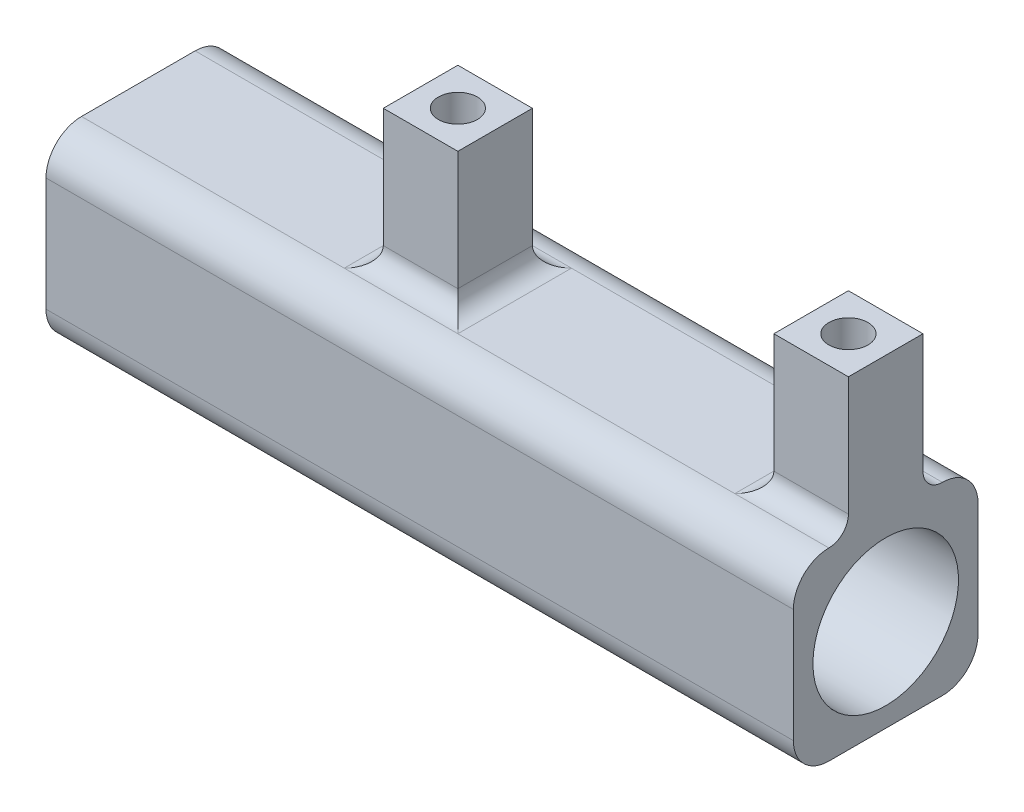
ISO-10303-21;
HEADER;
FILE_DESCRIPTION(('STEP AP214'),'2;1');
FILE_NAME('part.step','',(''),(''),'','','');
FILE_SCHEMA(('AUTOMOTIVE_DESIGN { 1 0 10303 214 1 1 1 1 }'));
ENDSEC;
DATA;
#1=APPLICATION_CONTEXT('core data for automotive mechanical design processes');
#2=APPLICATION_PROTOCOL_DEFINITION('international standard','automotive_design',2000,#1);
#3=PRODUCT_CONTEXT('',#1,'mechanical');
#4=PRODUCT('Part','Part','',(#3));
#5=PRODUCT_RELATED_PRODUCT_CATEGORY('part','',(#4));
#6=PRODUCT_DEFINITION_FORMATION('','',#4);
#7=PRODUCT_DEFINITION_CONTEXT('part definition',#1,'design');
#8=PRODUCT_DEFINITION('design','',#6,#7);
#9=PRODUCT_DEFINITION_SHAPE('','',#8);
#10=(LENGTH_UNIT() NAMED_UNIT(*) SI_UNIT(.MILLI.,.METRE.));
#11=(NAMED_UNIT(*) PLANE_ANGLE_UNIT() SI_UNIT($,.RADIAN.));
#12=(NAMED_UNIT(*) SI_UNIT($,.STERADIAN.) SOLID_ANGLE_UNIT());
#13=UNCERTAINTY_MEASURE_WITH_UNIT(LENGTH_MEASURE(1.E-05),#10,'distance_accuracy_value','');
#14=(GEOMETRIC_REPRESENTATION_CONTEXT(3) GLOBAL_UNCERTAINTY_ASSIGNED_CONTEXT((#13)) GLOBAL_UNIT_ASSIGNED_CONTEXT((#10,
#11,#12)) REPRESENTATION_CONTEXT('',''));
#15=CARTESIAN_POINT('',(0.,0.,0.));
#16=DIRECTION('',(0.,0.,1.));
#17=DIRECTION('',(1.,0.,0.));
#18=AXIS2_PLACEMENT_3D('',#15,#16,#17);
#19=CARTESIAN_POINT('',(0.,13.,13.));
#20=DIRECTION('',(0.,1.,0.));
#21=DIRECTION('',(-1.,0.,0.));
#22=AXIS2_PLACEMENT_3D('',#19,#20,#21);
#23=PLANE('',#22);
#24=DIRECTION('',(1.,0.,0.));
#25=VECTOR('',#24,1.);
#26=CARTESIAN_POINT('',(-52.625,13.,-8.));
#27=LINE('',#26,#25);
#28=CARTESIAN_POINT('',(39.375,13.,-8.));
#29=VERTEX_POINT('',#28);
#30=CARTESIAN_POINT('',(0.374999999999993,13.,-8.));
#31=VERTEX_POINT('',#30);
#32=EDGE_CURVE('E289',#29,#31,#27,.F.);
#33=ORIENTED_EDGE('',*,*,#32,.T.);
#34=DIRECTION('',(0.,0.,-1.));
#35=VECTOR('',#34,1.);
#36=CARTESIAN_POINT('',(0.374999999999991,13.,13.));
#37=LINE('',#36,#35);
#38=CARTESIAN_POINT('',(0.374999999999991,13.,8.));
#39=VERTEX_POINT('',#38);
#40=EDGE_CURVE('E296',#31,#39,#37,.F.);
#41=ORIENTED_EDGE('',*,*,#40,.T.);
#42=DIRECTION('',(1.,0.,0.));
#43=VECTOR('',#42,1.);
#44=CARTESIAN_POINT('',(0.,13.,8.));
#45=LINE('',#44,#43);
#46=CARTESIAN_POINT('',(39.375,13.,8.));
#47=VERTEX_POINT('',#46);
#48=EDGE_CURVE('E391',#39,#47,#45,.T.);
#49=ORIENTED_EDGE('',*,*,#48,.T.);
#50=DIRECTION('',(0.,0.,-1.));
#51=VECTOR('',#50,1.);
#52=CARTESIAN_POINT('',(39.375,13.,-5.25));
#53=LINE('',#52,#51);
#54=EDGE_CURVE('E295',#47,#29,#53,.T.);
#55=ORIENTED_EDGE('',*,*,#54,.T.);
#56=EDGE_LOOP('',(#33,#41,#49,#55));
#57=FACE_BOUND('',#56,.T.);
#58=ADVANCED_FACE('F44',(#57),#23,.T.);
#59=CARTESIAN_POINT('',(-52.625,13.,8.));
#60=VERTEX_POINT('',#59);
#61=CARTESIAN_POINT('',(-15.625,13.,8.));
#62=VERTEX_POINT('',#61);
#63=EDGE_CURVE('E279',#60,#62,#45,.T.);
#64=ORIENTED_EDGE('',*,*,#63,.T.);
#65=DIRECTION('',(0.,0.,-1.));
#66=VECTOR('',#65,1.);
#67=CARTESIAN_POINT('',(-15.625,13.,-5.25));
#68=LINE('',#67,#66);
#69=CARTESIAN_POINT('',(-15.625,13.,-8.));
#70=VERTEX_POINT('',#69);
#71=EDGE_CURVE('E298',#62,#70,#68,.T.);
#72=ORIENTED_EDGE('',*,*,#71,.T.);
#73=CARTESIAN_POINT('',(-52.625,13.,-7.99999999999999));
#74=VERTEX_POINT('',#73);
#75=EDGE_CURVE('E282',#70,#74,#27,.F.);
#76=ORIENTED_EDGE('',*,*,#75,.T.);
#77=DIRECTION('',(0.,0.,-1.));
#78=VECTOR('',#77,1.);
#79=CARTESIAN_POINT('',(-52.625,13.,13.));
#80=LINE('',#79,#78);
#81=EDGE_CURVE('E248',#60,#74,#80,.T.);
#82=ORIENTED_EDGE('',*,*,#81,.F.);
#83=EDGE_LOOP('',(#64,#72,#76,#82));
#84=FACE_BOUND('',#83,.T.);
#85=ADVANCED_FACE('F343',(#84),#23,.T.);
#86=CARTESIAN_POINT('',(52.625,0.,13.));
#87=DIRECTION('',(1.,0.,0.));
#88=DIRECTION('',(0.,0.,-1.));
#89=AXIS2_PLACEMENT_3D('',#86,#87,#88);
#90=PLANE('',#89);
#91=CARTESIAN_POINT('',(52.625,0.,0.));
#92=DIRECTION('',(-1.,0.,0.));
#93=DIRECTION('',(0.,0.,1.));
#94=AXIS2_PLACEMENT_3D('',#91,#92,#93);
#95=CIRCLE('',#94,10.25);
#96=CARTESIAN_POINT('',(52.625,0.,10.25));
#97=VERTEX_POINT('',#96);
#98=EDGE_CURVE('E224',#97,#97,#95,.T.);
#99=ORIENTED_EDGE('',*,*,#98,.T.);
#100=EDGE_LOOP('',(#99));
#101=FACE_BOUND('',#100,.T.);
#102=DIRECTION('',(0.,0.,-1.));
#103=VECTOR('',#102,1.);
#104=CARTESIAN_POINT('',(52.625,-13.,13.));
#105=LINE('',#104,#103);
#106=CARTESIAN_POINT('',(52.625,-13.,8.));
#107=VERTEX_POINT('',#106);
#108=CARTESIAN_POINT('',(52.625,-13.,-7.99999999999999));
#109=VERTEX_POINT('',#108);
#110=EDGE_CURVE('E237',#107,#109,#105,.T.);
#111=ORIENTED_EDGE('',*,*,#110,.T.);
#112=CARTESIAN_POINT('',(52.625,-8.00000000000002,-8.));
#113=DIRECTION('',(1.,0.,0.));
#114=DIRECTION('',(0.,0.,-1.));
#115=AXIS2_PLACEMENT_3D('',#112,#113,#114);
#116=CIRCLE('',#115,5.);
#117=CARTESIAN_POINT('',(52.625,-8.00000000000002,-13.));
#118=VERTEX_POINT('',#117);
#119=EDGE_CURVE('E263',#109,#118,#116,.T.);
#120=ORIENTED_EDGE('',*,*,#119,.T.);
#121=DIRECTION('',(0.,-1.,0.));
#122=VECTOR('',#121,1.);
#123=CARTESIAN_POINT('',(52.625,0.,-13.));
#124=LINE('',#123,#122);
#125=CARTESIAN_POINT('',(52.625,8.00000000000002,-13.));
#126=VERTEX_POINT('',#125);
#127=EDGE_CURVE('E194',#126,#118,#124,.T.);
#128=ORIENTED_EDGE('',*,*,#127,.F.);
#129=CARTESIAN_POINT('',(52.625,8.00000000000002,-8.));
#130=DIRECTION('',(1.,0.,0.));
#131=DIRECTION('',(0.,0.,-1.));
#132=AXIS2_PLACEMENT_3D('',#129,#130,#131);
#133=CIRCLE('',#132,5.);
#134=CARTESIAN_POINT('',(52.625,13.,-7.99999999999999));
#135=VERTEX_POINT('',#134);
#136=EDGE_CURVE('E261',#126,#135,#133,.T.);
#137=ORIENTED_EDGE('',*,*,#136,.T.);
#138=CARTESIAN_POINT('',(52.625,15.75,-8.));
#139=DIRECTION('',(1.,0.,0.));
#140=DIRECTION('',(0.,0.,-1.));
#141=AXIS2_PLACEMENT_3D('',#138,#139,#140);
#142=CIRCLE('',#141,2.75);
#143=CARTESIAN_POINT('',(52.625,15.75,-5.25));
#144=VERTEX_POINT('',#143);
#145=EDGE_CURVE('E53',#135,#144,#142,.F.);
#146=ORIENTED_EDGE('',*,*,#145,.T.);
#147=DIRECTION('',(0.,1.,0.));
#148=VECTOR('',#147,1.);
#149=CARTESIAN_POINT('',(52.625,0.,-5.25));
#150=LINE('',#149,#148);
#151=CARTESIAN_POINT('',(52.625,32.5,-5.25));
#152=VERTEX_POINT('',#151);
#153=EDGE_CURVE('E223',#144,#152,#150,.T.);
#154=ORIENTED_EDGE('',*,*,#153,.T.);
#155=DIRECTION('',(0.,0.,-1.));
#156=VECTOR('',#155,1.);
#157=CARTESIAN_POINT('',(52.625,32.5,5.25));
#158=LINE('',#157,#156);
#159=CARTESIAN_POINT('',(52.625,32.5,5.25));
#160=VERTEX_POINT('',#159);
#161=EDGE_CURVE('E206',#160,#152,#158,.T.);
#162=ORIENTED_EDGE('',*,*,#161,.F.);
#163=DIRECTION('',(0.,1.,0.));
#164=VECTOR('',#163,1.);
#165=CARTESIAN_POINT('',(52.625,0.,5.25));
#166=LINE('',#165,#164);
#167=CARTESIAN_POINT('',(52.625,15.75,5.25));
#168=VERTEX_POINT('',#167);
#169=EDGE_CURVE('E215',#168,#160,#166,.T.);
#170=ORIENTED_EDGE('',*,*,#169,.F.);
#171=CARTESIAN_POINT('',(52.625,15.75,8.));
#172=DIRECTION('',(1.,0.,0.));
#173=DIRECTION('',(0.,0.,-1.));
#174=AXIS2_PLACEMENT_3D('',#171,#172,#173);
#175=CIRCLE('',#174,2.75);
#176=CARTESIAN_POINT('',(52.625,13.,8.));
#177=VERTEX_POINT('',#176);
#178=EDGE_CURVE('E11',#168,#177,#175,.F.);
#179=ORIENTED_EDGE('',*,*,#178,.T.);
#180=CARTESIAN_POINT('',(52.625,8.00000000000002,8.));
#181=DIRECTION('',(1.,0.,0.));
#182=DIRECTION('',(0.,0.,-1.));
#183=AXIS2_PLACEMENT_3D('',#180,#181,#182);
#184=CIRCLE('',#183,5.);
#185=CARTESIAN_POINT('',(52.625,8.00000000000002,13.));
#186=VERTEX_POINT('',#185);
#187=EDGE_CURVE('E260',#177,#186,#184,.T.);
#188=ORIENTED_EDGE('',*,*,#187,.T.);
#189=DIRECTION('',(0.,-1.,0.));
#190=VECTOR('',#189,1.);
#191=CARTESIAN_POINT('',(52.625,0.,13.));
#192=LINE('',#191,#190);
#193=CARTESIAN_POINT('',(52.625,-8.00000000000002,13.));
#194=VERTEX_POINT('',#193);
#195=EDGE_CURVE('E235',#186,#194,#192,.T.);
#196=ORIENTED_EDGE('',*,*,#195,.T.);
#197=CARTESIAN_POINT('',(52.625,-8.00000000000002,8.));
#198=DIRECTION('',(1.,0.,0.));
#199=DIRECTION('',(0.,0.,-1.));
#200=AXIS2_PLACEMENT_3D('',#197,#198,#199);
#201=CIRCLE('',#200,5.);
#202=EDGE_CURVE('E258',#194,#107,#201,.T.);
#203=ORIENTED_EDGE('',*,*,#202,.T.);
#204=EDGE_LOOP('',(#111,#120,#128,#137,#146,#154,#162,#170,#179,#188,#196,#203));
#205=FACE_BOUND('',#204,.T.);
#206=ADVANCED_FACE('F359',(#101,#205),#90,.T.);
#207=CARTESIAN_POINT('',(-52.625,0.,13.));
#208=DIRECTION('',(1.,0.,0.));
#209=DIRECTION('',(0.,0.,-1.));
#210=AXIS2_PLACEMENT_3D('',#207,#208,#209);
#211=PLANE('',#210);
#212=CARTESIAN_POINT('',(-52.625,0.,0.));
#213=DIRECTION('',(-1.,0.,0.));
#214=DIRECTION('',(0.,0.,1.));
#215=AXIS2_PLACEMENT_3D('',#212,#213,#214);
#216=CIRCLE('',#215,10.25);
#217=CARTESIAN_POINT('',(-52.625,0.,10.25));
#218=VERTEX_POINT('',#217);
#219=EDGE_CURVE('E697',#218,#218,#216,.T.);
#220=ORIENTED_EDGE('',*,*,#219,.F.);
#221=EDGE_LOOP('',(#220));
#222=FACE_BOUND('',#221,.T.);
#223=DIRECTION('',(0.,-1.,0.));
#224=VECTOR('',#223,1.);
#225=CARTESIAN_POINT('',(-52.625,0.,-13.));
#226=LINE('',#225,#224);
#227=CARTESIAN_POINT('',(-52.625,8.,-13.));
#228=VERTEX_POINT('',#227);
#229=CARTESIAN_POINT('',(-52.625,-8.,-13.));
#230=VERTEX_POINT('',#229);
#231=EDGE_CURVE('E236',#228,#230,#226,.T.);
#232=ORIENTED_EDGE('',*,*,#231,.T.);
#233=CARTESIAN_POINT('',(-52.625,-8.,-8.));
#234=DIRECTION('',(1.,0.,0.));
#235=DIRECTION('',(0.,0.,-1.));
#236=AXIS2_PLACEMENT_3D('',#233,#234,#235);
#237=CIRCLE('',#236,5.);
#238=CARTESIAN_POINT('',(-52.625,-13.,-7.99999999999999));
#239=VERTEX_POINT('',#238);
#240=EDGE_CURVE('E280',#230,#239,#237,.F.);
#241=ORIENTED_EDGE('',*,*,#240,.T.);
#242=DIRECTION('',(0.,0.,-1.));
#243=VECTOR('',#242,1.);
#244=CARTESIAN_POINT('',(-52.625,-13.,13.));
#245=LINE('',#244,#243);
#246=CARTESIAN_POINT('',(-52.625,-13.,8.));
#247=VERTEX_POINT('',#246);
#248=EDGE_CURVE('E246',#247,#239,#245,.T.);
#249=ORIENTED_EDGE('',*,*,#248,.F.);
#250=CARTESIAN_POINT('',(-52.625,-8.,8.));
#251=DIRECTION('',(1.,0.,0.));
#252=DIRECTION('',(0.,0.,-1.));
#253=AXIS2_PLACEMENT_3D('',#250,#251,#252);
#254=CIRCLE('',#253,5.);
#255=CARTESIAN_POINT('',(-52.625,-8.,13.));
#256=VERTEX_POINT('',#255);
#257=EDGE_CURVE('E271',#247,#256,#254,.F.);
#258=ORIENTED_EDGE('',*,*,#257,.T.);
#259=DIRECTION('',(0.,-1.,0.));
#260=VECTOR('',#259,1.);
#261=CARTESIAN_POINT('',(-52.625,0.,13.));
#262=LINE('',#261,#260);
#263=CARTESIAN_POINT('',(-52.625,8.,13.));
#264=VERTEX_POINT('',#263);
#265=EDGE_CURVE('E232',#264,#256,#262,.T.);
#266=ORIENTED_EDGE('',*,*,#265,.F.);
#267=CARTESIAN_POINT('',(-52.625,8.,8.));
#268=DIRECTION('',(1.,0.,0.));
#269=DIRECTION('',(0.,0.,-1.));
#270=AXIS2_PLACEMENT_3D('',#267,#268,#269);
#271=CIRCLE('',#270,5.);
#272=EDGE_CURVE('E272',#264,#60,#271,.F.);
#273=ORIENTED_EDGE('',*,*,#272,.T.);
#274=ORIENTED_EDGE('',*,*,#81,.T.);
#275=CARTESIAN_POINT('',(-52.625,8.,-8.));
#276=DIRECTION('',(1.,0.,0.));
#277=DIRECTION('',(0.,0.,-1.));
#278=AXIS2_PLACEMENT_3D('',#275,#276,#277);
#279=CIRCLE('',#278,5.);
#280=EDGE_CURVE('E273',#74,#228,#279,.F.);
#281=ORIENTED_EDGE('',*,*,#280,.T.);
#282=EDGE_LOOP('',(#232,#241,#249,#258,#266,#273,#274,#281));
#283=FACE_BOUND('',#282,.T.);
#284=ADVANCED_FACE('F347',(#222,#283),#211,.F.);
#285=CARTESIAN_POINT('',(0.,-13.,13.));
#286=DIRECTION('',(0.,1.,0.));
#287=DIRECTION('',(-1.,0.,0.));
#288=AXIS2_PLACEMENT_3D('',#285,#286,#287);
#289=PLANE('',#288);
#290=ORIENTED_EDGE('',*,*,#248,.T.);
#291=DIRECTION('',(1.,0.,0.));
#292=VECTOR('',#291,1.);
#293=CARTESIAN_POINT('',(0.,-13.,-8.));
#294=LINE('',#293,#292);
#295=EDGE_CURVE('E251',#239,#109,#294,.T.);
#296=ORIENTED_EDGE('',*,*,#295,.T.);
#297=ORIENTED_EDGE('',*,*,#110,.F.);
#298=DIRECTION('',(1.,0.,0.));
#299=VECTOR('',#298,1.);
#300=CARTESIAN_POINT('',(-52.625,-13.,8.));
#301=LINE('',#300,#299);
#302=EDGE_CURVE('E255',#107,#247,#301,.F.);
#303=ORIENTED_EDGE('',*,*,#302,.T.);
#304=EDGE_LOOP('',(#290,#296,#297,#303));
#305=FACE_BOUND('',#304,.T.);
#306=ADVANCED_FACE('F370',(#305),#289,.F.);
#307=CARTESIAN_POINT('',(0.,0.,13.));
#308=DIRECTION('',(0.,0.,1.));
#309=DIRECTION('',(1.,0.,0.));
#310=AXIS2_PLACEMENT_3D('',#307,#308,#309);
#311=PLANE('',#310);
#312=ORIENTED_EDGE('',*,*,#265,.T.);
#313=DIRECTION('',(1.,0.,0.));
#314=VECTOR('',#313,1.);
#315=CARTESIAN_POINT('',(52.625,-8.00000000000002,13.));
#316=LINE('',#315,#314);
#317=EDGE_CURVE('E293',#256,#194,#316,.T.);
#318=ORIENTED_EDGE('',*,*,#317,.T.);
#319=ORIENTED_EDGE('',*,*,#195,.F.);
#320=DIRECTION('',(1.,0.,0.));
#321=VECTOR('',#320,1.);
#322=CARTESIAN_POINT('',(0.,8.00000000000001,13.));
#323=LINE('',#322,#321);
#324=EDGE_CURVE('E286',#186,#264,#323,.F.);
#325=ORIENTED_EDGE('',*,*,#324,.T.);
#326=EDGE_LOOP('',(#312,#318,#319,#325));
#327=FACE_BOUND('',#326,.T.);
#328=ADVANCED_FACE('F376',(#327),#311,.T.);
#329=CARTESIAN_POINT('',(0.,0.,-13.));
#330=DIRECTION('',(0.,0.,1.));
#331=DIRECTION('',(1.,0.,0.));
#332=AXIS2_PLACEMENT_3D('',#329,#330,#331);
#333=PLANE('',#332);
#334=ORIENTED_EDGE('',*,*,#127,.T.);
#335=DIRECTION('',(1.,0.,0.));
#336=VECTOR('',#335,1.);
#337=CARTESIAN_POINT('',(0.,-8.00000000000001,-13.));
#338=LINE('',#337,#336);
#339=EDGE_CURVE('E268',#118,#230,#338,.F.);
#340=ORIENTED_EDGE('',*,*,#339,.T.);
#341=ORIENTED_EDGE('',*,*,#231,.F.);
#342=DIRECTION('',(1.,0.,0.));
#343=VECTOR('',#342,1.);
#344=CARTESIAN_POINT('',(52.625,8.00000000000002,-13.));
#345=LINE('',#344,#343);
#346=EDGE_CURVE('E269',#228,#126,#345,.T.);
#347=ORIENTED_EDGE('',*,*,#346,.T.);
#348=EDGE_LOOP('',(#334,#340,#341,#347));
#349=FACE_BOUND('',#348,.T.);
#350=ADVANCED_FACE('F357',(#349),#333,.F.);
#351=CARTESIAN_POINT('',(0.,32.5,5.25));
#352=DIRECTION('',(0.,1.,0.));
#353=DIRECTION('',(0.,0.,1.));
#354=AXIS2_PLACEMENT_3D('',#351,#352,#353);
#355=PLANE('',#354);
#356=CARTESIAN_POINT('',(47.375,32.5,0.));
#357=DIRECTION('',(0.,1.,0.));
#358=DIRECTION('',(0.,0.,1.));
#359=AXIS2_PLACEMENT_3D('',#356,#357,#358);
#360=CIRCLE('',#359,2.75);
#361=CARTESIAN_POINT('',(47.375,32.5,2.75));
#362=VERTEX_POINT('',#361);
#363=EDGE_CURVE('E319',#362,#362,#360,.T.);
#364=ORIENTED_EDGE('',*,*,#363,.F.);
#365=EDGE_LOOP('',(#364));
#366=FACE_BOUND('',#365,.T.);
#367=DIRECTION('',(1.,0.,0.));
#368=VECTOR('',#367,1.);
#369=CARTESIAN_POINT('',(0.,32.5,-5.25));
#370=LINE('',#369,#368);
#371=CARTESIAN_POINT('',(42.125,32.5,-5.25));
#372=VERTEX_POINT('',#371);
#373=EDGE_CURVE('E221',#372,#152,#370,.T.);
#374=ORIENTED_EDGE('',*,*,#373,.F.);
#375=DIRECTION('',(0.,0.,-1.));
#376=VECTOR('',#375,1.);
#377=CARTESIAN_POINT('',(42.125,32.5,5.25));
#378=LINE('',#377,#376);
#379=CARTESIAN_POINT('',(42.125,32.5,5.25));
#380=VERTEX_POINT('',#379);
#381=EDGE_CURVE('E216',#380,#372,#378,.T.);
#382=ORIENTED_EDGE('',*,*,#381,.F.);
#383=DIRECTION('',(1.,0.,0.));
#384=VECTOR('',#383,1.);
#385=CARTESIAN_POINT('',(0.,32.5,5.25));
#386=LINE('',#385,#384);
#387=EDGE_CURVE('E213',#380,#160,#386,.T.);
#388=ORIENTED_EDGE('',*,*,#387,.T.);
#389=ORIENTED_EDGE('',*,*,#161,.T.);
#390=EDGE_LOOP('',(#374,#382,#388,#389));
#391=FACE_BOUND('',#390,.T.);
#392=ADVANCED_FACE('F412',(#366,#391),#355,.T.);
#393=CARTESIAN_POINT('',(42.125,0.,5.25));
#394=DIRECTION('',(-1.,0.,0.));
#395=DIRECTION('',(0.,-1.,0.));
#396=AXIS2_PLACEMENT_3D('',#393,#394,#395);
#397=PLANE('',#396);
#398=DIRECTION('',(0.,1.,0.));
#399=VECTOR('',#398,1.);
#400=CARTESIAN_POINT('',(42.125,0.,-5.25));
#401=LINE('',#400,#399);
#402=CARTESIAN_POINT('',(42.125,15.75,-5.25));
#403=VERTEX_POINT('',#402);
#404=EDGE_CURVE('E214',#403,#372,#401,.T.);
#405=ORIENTED_EDGE('',*,*,#404,.F.);
#406=DIRECTION('',(0.,0.,-1.));
#407=VECTOR('',#406,1.);
#408=CARTESIAN_POINT('',(42.125,15.75,5.25));
#409=LINE('',#408,#407);
#410=CARTESIAN_POINT('',(42.125,15.75,5.25));
#411=VERTEX_POINT('',#410);
#412=EDGE_CURVE('E307',#403,#411,#409,.F.);
#413=ORIENTED_EDGE('',*,*,#412,.T.);
#414=DIRECTION('',(0.,1.,0.));
#415=VECTOR('',#414,1.);
#416=CARTESIAN_POINT('',(42.125,0.,5.25));
#417=LINE('',#416,#415);
#418=EDGE_CURVE('E217',#411,#380,#417,.T.);
#419=ORIENTED_EDGE('',*,*,#418,.T.);
#420=ORIENTED_EDGE('',*,*,#381,.T.);
#421=EDGE_LOOP('',(#405,#413,#419,#420));
#422=FACE_BOUND('',#421,.T.);
#423=ADVANCED_FACE('F419',(#422),#397,.T.);
#424=CARTESIAN_POINT('',(0.,0.,5.25));
#425=DIRECTION('',(0.,0.,1.));
#426=DIRECTION('',(1.,0.,0.));
#427=AXIS2_PLACEMENT_3D('',#424,#425,#426);
#428=PLANE('',#427);
#429=ORIENTED_EDGE('',*,*,#418,.F.);
#430=DIRECTION('',(1.,0.,0.));
#431=VECTOR('',#430,1.);
#432=CARTESIAN_POINT('',(52.625,15.75,5.25));
#433=LINE('',#432,#431);
#434=EDGE_CURVE('E305',#411,#168,#433,.T.);
#435=ORIENTED_EDGE('',*,*,#434,.T.);
#436=ORIENTED_EDGE('',*,*,#169,.T.);
#437=ORIENTED_EDGE('',*,*,#387,.F.);
#438=EDGE_LOOP('',(#429,#435,#436,#437));
#439=FACE_BOUND('',#438,.T.);
#440=ADVANCED_FACE('F420',(#439),#428,.T.);
#441=CARTESIAN_POINT('',(0.,0.,-5.25));
#442=DIRECTION('',(0.,0.,1.));
#443=DIRECTION('',(1.,0.,0.));
#444=AXIS2_PLACEMENT_3D('',#441,#442,#443);
#445=PLANE('',#444);
#446=ORIENTED_EDGE('',*,*,#153,.F.);
#447=DIRECTION('',(1.,0.,0.));
#448=VECTOR('',#447,1.);
#449=CARTESIAN_POINT('',(0.,15.75,-5.25));
#450=LINE('',#449,#448);
#451=EDGE_CURVE('E297',#144,#403,#450,.F.);
#452=ORIENTED_EDGE('',*,*,#451,.T.);
#453=ORIENTED_EDGE('',*,*,#404,.T.);
#454=ORIENTED_EDGE('',*,*,#373,.T.);
#455=EDGE_LOOP('',(#446,#452,#453,#454));
#456=FACE_BOUND('',#455,.T.);
#457=ADVANCED_FACE('F407',(#456),#445,.F.);
#458=CARTESIAN_POINT('',(-2.375,0.,5.25));
#459=DIRECTION('',(-1.,0.,0.));
#460=DIRECTION('',(0.,-1.,0.));
#461=AXIS2_PLACEMENT_3D('',#458,#459,#460);
#462=PLANE('',#461);
#463=DIRECTION('',(0.,1.,0.));
#464=VECTOR('',#463,1.);
#465=CARTESIAN_POINT('',(-2.375,0.,5.25));
#466=LINE('',#465,#464);
#467=CARTESIAN_POINT('',(-2.37500000000001,15.75,5.25));
#468=VERTEX_POINT('',#467);
#469=CARTESIAN_POINT('',(-2.37500000000001,32.5,5.25));
#470=VERTEX_POINT('',#469);
#471=EDGE_CURVE('E178',#468,#470,#466,.T.);
#472=ORIENTED_EDGE('',*,*,#471,.F.);
#473=DIRECTION('',(0.,0.,-1.));
#474=VECTOR('',#473,1.);
#475=CARTESIAN_POINT('',(-2.37500000000001,15.75,5.25));
#476=LINE('',#475,#474);
#477=CARTESIAN_POINT('',(-2.37500000000001,15.75,-5.25));
#478=VERTEX_POINT('',#477);
#479=EDGE_CURVE('E65',#468,#478,#476,.T.);
#480=ORIENTED_EDGE('',*,*,#479,.T.);
#481=DIRECTION('',(0.,1.,0.));
#482=VECTOR('',#481,1.);
#483=CARTESIAN_POINT('',(-2.375,0.,-5.25));
#484=LINE('',#483,#482);
#485=CARTESIAN_POINT('',(-2.37500000000001,32.5,-5.25));
#486=VERTEX_POINT('',#485);
#487=EDGE_CURVE('E191',#478,#486,#484,.T.);
#488=ORIENTED_EDGE('',*,*,#487,.T.);
#489=DIRECTION('',(0.,0.,-1.));
#490=VECTOR('',#489,1.);
#491=CARTESIAN_POINT('',(-2.37500000000001,32.5,5.25));
#492=LINE('',#491,#490);
#493=EDGE_CURVE('E186',#470,#486,#492,.T.);
#494=ORIENTED_EDGE('',*,*,#493,.F.);
#495=EDGE_LOOP('',(#472,#480,#488,#494));
#496=FACE_BOUND('',#495,.T.);
#497=ADVANCED_FACE('F188',(#496),#462,.F.);
#498=CARTESIAN_POINT('',(0.,32.5,5.25));
#499=DIRECTION('',(0.,1.,0.));
#500=DIRECTION('',(0.,0.,1.));
#501=AXIS2_PLACEMENT_3D('',#498,#499,#500);
#502=PLANE('',#501);
#503=CARTESIAN_POINT('',(-7.62500000000001,32.5,0.));
#504=DIRECTION('',(0.,1.,0.));
#505=DIRECTION('',(0.,0.,1.));
#506=AXIS2_PLACEMENT_3D('',#503,#504,#505);
#507=CIRCLE('',#506,2.75);
#508=CARTESIAN_POINT('',(-7.62500000000001,32.5,2.75));
#509=VERTEX_POINT('',#508);
#510=EDGE_CURVE('E701',#509,#509,#507,.T.);
#511=ORIENTED_EDGE('',*,*,#510,.F.);
#512=EDGE_LOOP('',(#511));
#513=FACE_BOUND('',#512,.T.);
#514=DIRECTION('',(1.,0.,0.));
#515=VECTOR('',#514,1.);
#516=CARTESIAN_POINT('',(0.,32.5,-5.25));
#517=LINE('',#516,#515);
#518=CARTESIAN_POINT('',(-12.875,32.5,-5.25));
#519=VERTEX_POINT('',#518);
#520=EDGE_CURVE('E210',#519,#486,#517,.T.);
#521=ORIENTED_EDGE('',*,*,#520,.F.);
#522=DIRECTION('',(0.,0.,-1.));
#523=VECTOR('',#522,1.);
#524=CARTESIAN_POINT('',(-12.875,32.5,5.25));
#525=LINE('',#524,#523);
#526=CARTESIAN_POINT('',(-12.875,32.5,5.25));
#527=VERTEX_POINT('',#526);
#528=EDGE_CURVE('E196',#527,#519,#525,.T.);
#529=ORIENTED_EDGE('',*,*,#528,.F.);
#530=DIRECTION('',(1.,0.,0.));
#531=VECTOR('',#530,1.);
#532=CARTESIAN_POINT('',(0.,32.5,5.25));
#533=LINE('',#532,#531);
#534=EDGE_CURVE('E182',#527,#470,#533,.T.);
#535=ORIENTED_EDGE('',*,*,#534,.T.);
#536=ORIENTED_EDGE('',*,*,#493,.T.);
#537=EDGE_LOOP('',(#521,#529,#535,#536));
#538=FACE_BOUND('',#537,.T.);
#539=ADVANCED_FACE('F198',(#513,#538),#502,.T.);
#540=CARTESIAN_POINT('',(-12.875,0.,5.25));
#541=DIRECTION('',(-1.,0.,0.));
#542=DIRECTION('',(0.,-1.,0.));
#543=AXIS2_PLACEMENT_3D('',#540,#541,#542);
#544=PLANE('',#543);
#545=DIRECTION('',(0.,1.,0.));
#546=VECTOR('',#545,1.);
#547=CARTESIAN_POINT('',(-12.875,0.,-5.25));
#548=LINE('',#547,#546);
#549=CARTESIAN_POINT('',(-12.875,15.75,-5.25));
#550=VERTEX_POINT('',#549);
#551=EDGE_CURVE('E187',#550,#519,#548,.T.);
#552=ORIENTED_EDGE('',*,*,#551,.F.);
#553=DIRECTION('',(0.,0.,-1.));
#554=VECTOR('',#553,1.);
#555=CARTESIAN_POINT('',(-12.875,15.75,5.25));
#556=LINE('',#555,#554);
#557=CARTESIAN_POINT('',(-12.875,15.75,5.25));
#558=VERTEX_POINT('',#557);
#559=EDGE_CURVE('E310',#550,#558,#556,.F.);
#560=ORIENTED_EDGE('',*,*,#559,.T.);
#561=DIRECTION('',(0.,1.,0.));
#562=VECTOR('',#561,1.);
#563=CARTESIAN_POINT('',(-12.875,0.,5.25));
#564=LINE('',#563,#562);
#565=EDGE_CURVE('E204',#558,#527,#564,.T.);
#566=ORIENTED_EDGE('',*,*,#565,.T.);
#567=ORIENTED_EDGE('',*,*,#528,.T.);
#568=EDGE_LOOP('',(#552,#560,#566,#567));
#569=FACE_BOUND('',#568,.T.);
#570=ADVANCED_FACE('F512',(#569),#544,.T.);
#571=CARTESIAN_POINT('',(0.,0.,5.25));
#572=DIRECTION('',(0.,0.,1.));
#573=DIRECTION('',(1.,0.,0.));
#574=AXIS2_PLACEMENT_3D('',#571,#572,#573);
#575=PLANE('',#574);
#576=ORIENTED_EDGE('',*,*,#565,.F.);
#577=DIRECTION('',(1.,0.,0.));
#578=VECTOR('',#577,1.);
#579=CARTESIAN_POINT('',(-2.37500000000001,15.75,5.25));
#580=LINE('',#579,#578);
#581=EDGE_CURVE('E184',#558,#468,#580,.T.);
#582=ORIENTED_EDGE('',*,*,#581,.T.);
#583=ORIENTED_EDGE('',*,*,#471,.T.);
#584=ORIENTED_EDGE('',*,*,#534,.F.);
#585=EDGE_LOOP('',(#576,#582,#583,#584));
#586=FACE_BOUND('',#585,.T.);
#587=ADVANCED_FACE('F181',(#586),#575,.T.);
#588=CARTESIAN_POINT('',(0.,0.,-5.25));
#589=DIRECTION('',(0.,0.,1.));
#590=DIRECTION('',(1.,0.,0.));
#591=AXIS2_PLACEMENT_3D('',#588,#589,#590);
#592=PLANE('',#591);
#593=ORIENTED_EDGE('',*,*,#487,.F.);
#594=DIRECTION('',(1.,0.,0.));
#595=VECTOR('',#594,1.);
#596=CARTESIAN_POINT('',(0.,15.75,-5.25));
#597=LINE('',#596,#595);
#598=EDGE_CURVE('E68',#478,#550,#597,.F.);
#599=ORIENTED_EDGE('',*,*,#598,.T.);
#600=ORIENTED_EDGE('',*,*,#551,.T.);
#601=ORIENTED_EDGE('',*,*,#520,.T.);
#602=EDGE_LOOP('',(#593,#599,#600,#601));
#603=FACE_BOUND('',#602,.T.);
#604=ADVANCED_FACE('F498',(#603),#592,.F.);
#605=CARTESIAN_POINT('',(52.625,0.,0.));
#606=DIRECTION('',(-1.,0.,0.));
#607=DIRECTION('',(0.,0.,1.));
#608=AXIS2_PLACEMENT_3D('',#605,#606,#607);
#609=CYLINDRICAL_SURFACE('',#608,10.25);
#610=CARTESIAN_POINT('',(-7.62500000000001,9.87420882906575,2.75));
#611=CARTESIAN_POINT('',(-7.77645509698531,9.87421142000658,2.74999641852672));
#612=CARTESIAN_POINT('',(-7.92794794675305,9.8777315552006,2.73744538707831));
#613=CARTESIAN_POINT('',(-8.22655602210647,9.89138899649363,2.68766959703062));
#614=CARTESIAN_POINT('',(-8.37366904892309,9.90152956952478,2.65043265674211));
#615=CARTESIAN_POINT('',(-8.65915448029185,9.92719857318878,2.55259918092325));
#616=CARTESIAN_POINT('',(-8.79753895497372,9.94271936184499,2.49203576448205));
#617=CARTESIAN_POINT('',(-9.06220545113497,9.9773902227867,2.34937251579786));
#618=CARTESIAN_POINT('',(-9.18848648923421,9.99654058959246,2.26727093564368));
#619=CARTESIAN_POINT('',(-9.42855865963669,10.0368561494227,2.0816391185361));
#620=CARTESIAN_POINT('',(-9.54199799095218,10.0580574118572,1.97766164664345));
#621=CARTESIAN_POINT('',(-9.75005559037505,10.0997747422464,1.75219127891973));
#622=CARTESIAN_POINT('',(-9.84467188702355,10.1202907382415,1.63069655068844));
#623=CARTESIAN_POINT('',(-10.013867399426,10.1587287634245,1.37119812059342));
#624=CARTESIAN_POINT('',(-10.0880964552198,10.1766032834179,1.23295846234391));
#625=CARTESIAN_POINT('',(-10.2121260725673,10.207330281846,0.945401568427303));
#626=CARTESIAN_POINT('',(-10.2619308056386,10.2201836177905,0.796086229434127));
#627=CARTESIAN_POINT('',(-10.3345582376491,10.2391649721558,0.49428897187631));
#628=CARTESIAN_POINT('',(-10.3579794714225,10.2454419404089,0.341960623091437));
#629=CARTESIAN_POINT('',(-10.3790586000857,10.2510842726084,0.0354161179543735));
#630=CARTESIAN_POINT('',(-10.3767208577368,10.2504508069654,-0.11879971429793));
#631=CARTESIAN_POINT('',(-10.3467689735511,10.2424526029902,-0.420574001413101));
#632=CARTESIAN_POINT('',(-10.3198015641962,10.2352601009123,-0.56820190886563));
#633=CARTESIAN_POINT('',(-10.2424012088933,10.2151555013667,-0.856754826665602));
#634=CARTESIAN_POINT('',(-10.1919669167425,10.2022430757716,-0.997679451960798));
#635=CARTESIAN_POINT('',(-10.068571481833,10.171894819623,-1.27047117502327));
#636=CARTESIAN_POINT('',(-9.99538960332091,10.1544149450419,-1.40223332311184));
#637=CARTESIAN_POINT('',(-9.82874600843088,10.116813843655,-1.65182682840281));
#638=CARTESIAN_POINT('',(-9.73528029735722,10.0966920968678,-1.76965543446336));
#639=CARTESIAN_POINT('',(-9.52729259996934,10.0552490720965,-1.9918974604122));
#640=CARTESIAN_POINT('',(-9.41220669354926,10.0339099488651,-2.09578042275064));
#641=CARTESIAN_POINT('',(-9.16602688788025,9.99300041645461,-2.28290216765602));
#642=CARTESIAN_POINT('',(-9.0349319885256,9.9734301179097,-2.36613965948396));
#643=CARTESIAN_POINT('',(-8.75929400018531,9.9382017982341,-2.5100181496188));
#644=CARTESIAN_POINT('',(-8.614671295465,9.92256923479772,-2.57051329528068));
#645=CARTESIAN_POINT('',(-8.31678359133075,9.89730186954246,-2.66615639745363));
#646=CARTESIAN_POINT('',(-8.16352077577536,9.88766555946863,-2.70131072836593));
#647=CARTESIAN_POINT('',(-7.85766849071982,9.87580353956031,-2.7443563016815));
#648=CARTESIAN_POINT('',(-7.70519870899628,9.87336262667371,-2.75303953268109));
#649=CARTESIAN_POINT('',(-7.40098541532601,9.87557868684587,-2.74507987262269));
#650=CARTESIAN_POINT('',(-7.24924182678341,9.88023489400491,-2.72843971438858));
#651=CARTESIAN_POINT('',(-6.9538512877453,9.89591252586954,-2.67100418253841));
#652=CARTESIAN_POINT('',(-6.8101041285733,9.90680798392472,-2.63068644486987));
#653=CARTESIAN_POINT('',(-6.53141283579391,9.9336130680232,-2.52757804085678));
#654=CARTESIAN_POINT('',(-6.39646986490297,9.94952335473359,-2.46478441332984));
#655=CARTESIAN_POINT('',(-6.13590822703486,9.98500597931734,-2.31690378867196));
#656=CARTESIAN_POINT('',(-6.01056327126833,10.0046518133184,-2.23135256316821));
#657=CARTESIAN_POINT('',(-5.77571772487154,10.045219740661,-2.04095953514443));
#658=CARTESIAN_POINT('',(-5.66622015758342,10.0661420764522,-1.93611406033879));
#659=CARTESIAN_POINT('',(-5.46288186009319,10.1076476211022,-1.70644260293079));
#660=CARTESIAN_POINT('',(-5.36959386516983,10.1282029328202,-1.58112120814897));
#661=CARTESIAN_POINT('',(-5.20537821375335,10.1660298949961,-1.31613852093554));
#662=CARTESIAN_POINT('',(-5.13444936671601,10.1833017202683,-1.17647799253636));
#663=CARTESIAN_POINT('',(-5.01761931072982,10.2125043146339,-0.887764662718021));
#664=CARTESIAN_POINT('',(-4.9715308252015,10.2244749248245,-0.738791869138219));
#665=CARTESIAN_POINT('',(-4.90514864898007,10.241901732593,-0.434846291608198));
#666=CARTESIAN_POINT('',(-4.88484916666117,10.2473593928152,-0.279874862874304));
#667=CARTESIAN_POINT('',(-4.87098774056168,10.2510753686306,0.0265077536173363));
#668=CARTESIAN_POINT('',(-4.87661546574199,10.2495518816832,0.177880149595932));
#669=CARTESIAN_POINT('',(-4.9125646203722,10.2399711516235,0.477441045117285));
#670=CARTESIAN_POINT('',(-4.94288510235096,10.2319141592045,0.625629666598844));
#671=CARTESIAN_POINT('',(-5.02689866955102,10.2102159433501,0.913629119281537));
#672=CARTESIAN_POINT('',(-5.08042556314463,10.1966144671163,1.05349162418865));
#673=CARTESIAN_POINT('',(-5.20918424619608,10.1652486807351,1.32233016180055));
#674=CARTESIAN_POINT('',(-5.28441910825478,10.1474837813531,1.45130465004516));
#675=CARTESIAN_POINT('',(-5.45681971958022,10.1090935009248,1.69847132944727));
#676=CARTESIAN_POINT('',(-5.55452143523512,10.0884039781303,1.81627968745121));
#677=CARTESIAN_POINT('',(-5.7680682584788,10.046753128908,2.03410318821535));
#678=CARTESIAN_POINT('',(-5.88391815282852,10.0257917321124,2.13411362168958));
#679=CARTESIAN_POINT('',(-6.1335857892534,9.98543072929821,2.31571567494096));
#680=CARTESIAN_POINT('',(-6.26774707795826,9.96607646773557,2.39684597226884));
#681=CARTESIAN_POINT('',(-6.54830830505539,9.93176477986437,2.53528476788687));
#682=CARTESIAN_POINT('',(-6.69470025797566,9.91680451306458,2.59260866575479));
#683=CARTESIAN_POINT('',(-6.97126777049536,9.8950248995127,2.67440892669434));
#684=CARTESIAN_POINT('',(-7.10025809921031,9.88728249452066,2.7026885219777));
#685=CARTESIAN_POINT('',(-7.36115629826024,9.87687362838604,2.74048451848962));
#686=CARTESIAN_POINT('',(-7.49306382464689,9.87420657203491,2.75000311990745));
#687=CARTESIAN_POINT('',(-7.62500000000001,9.87420882906575,2.75));
#688=B_SPLINE_CURVE_WITH_KNOTS('',3,(#610,#611,#612,#613,#614,#615,#616,#617,#618,#619,#620,
#621,#622,#623,#624,#625,#626,#627,#628,#629,#630,#631,#632,#633,#634,#635,#636,#637,#638,#639,
#640,#641,#642,#643,#644,#645,#646,#647,#648,#649,#650,#651,#652,#653,#654,#655,#656,#657,#658,
#659,#660,#661,#662,#663,#664,#665,#666,#667,#668,#669,#670,#671,#672,#673,#674,#675,#676,#677,
#678,#679,#680,#681,#682,#683,#684,#685,#686,#687),.UNSPECIFIED.,.T.,.F.,(4,2,2,2,2,2,2,2,2,2,2,
2,2,2,2,2,2,2,2,2,2,2,2,2,2,2,2,2,2,2,2,2,2,2,2,2,2,2,4),(0.,0.453880073020924,
0.907984287908278,1.36144612520928,1.8149447742067,2.27881759869188,2.74273898204713,
3.21419051179028,3.68556149257116,4.14600892178509,4.60637836687014,5.05499635098104,
5.50364007371768,5.95678088164261,6.41001101218317,6.87732087123618,7.3446599387837,
7.81494701816984,8.28511575701835,8.74107220542641,9.19697945187723,9.64399132700139,
10.0910621173108,10.5480639024361,11.0051527591057,11.4756340580597,11.9460903013435,
12.4129482208432,12.8797012760874,13.3319671222126,13.784215615531,14.2332775095089,
14.6824029960517,15.1436216682799,15.6049621969428,16.0766077302194,16.5479476944856,
16.9433799124801,17.3387657535336),.UNSPECIFIED.);
#689=CARTESIAN_POINT('',(-7.62500000000001,9.87420882906575,2.75));
#690=VERTEX_POINT('',#689);
#691=EDGE_CURVE('E696',#690,#690,#688,.T.);
#692=ORIENTED_EDGE('',*,*,#691,.F.);
#693=EDGE_LOOP('',(#692));
#694=FACE_BOUND('',#693,.T.);
#695=CARTESIAN_POINT('',(47.375,9.87420882906575,2.75));
#696=CARTESIAN_POINT('',(47.2235449030147,9.87421142000658,2.74999641852673));
#697=CARTESIAN_POINT('',(47.0720520532469,9.8777315552006,2.73744538707831));
#698=CARTESIAN_POINT('',(46.7734439778935,9.89138899649363,2.68766959703062));
#699=CARTESIAN_POINT('',(46.6263309510769,9.90152956952478,2.65043265674211));
#700=CARTESIAN_POINT('',(46.3408455197081,9.92719857318878,2.55259918092325));
#701=CARTESIAN_POINT('',(46.2024610450263,9.942719361845,2.49203576448206));
#702=CARTESIAN_POINT('',(45.937794548865,9.9773902227867,2.34937251579786));
#703=CARTESIAN_POINT('',(45.8115135107658,9.99654058959246,2.26727093564368));
#704=CARTESIAN_POINT('',(45.5714413403633,10.0368561494227,2.08163911853611));
#705=CARTESIAN_POINT('',(45.4580020090478,10.0580574118572,1.97766164664346));
#706=CARTESIAN_POINT('',(45.249944409625,10.0997747422464,1.75219127891973));
#707=CARTESIAN_POINT('',(45.1553281129765,10.1202907382415,1.63069655068845));
#708=CARTESIAN_POINT('',(44.986132600574,10.1587287634245,1.37119812059343));
#709=CARTESIAN_POINT('',(44.9119035447802,10.1766032834179,1.23295846234392));
#710=CARTESIAN_POINT('',(44.7878739274327,10.207330281846,0.945401568427311));
#711=CARTESIAN_POINT('',(44.7380691943614,10.2201836177905,0.796086229434134));
#712=CARTESIAN_POINT('',(44.6654417623509,10.2391649721558,0.494288971876315));
#713=CARTESIAN_POINT('',(44.6420205285775,10.2454419404089,0.341960623091443));
#714=CARTESIAN_POINT('',(44.6209413999143,10.2510842726084,0.035416117954378));
#715=CARTESIAN_POINT('',(44.6232791422632,10.2504508069654,-0.118799714297927));
#716=CARTESIAN_POINT('',(44.6532310264489,10.2424526029902,-0.420574001413099));
#717=CARTESIAN_POINT('',(44.6801984358038,10.2352601009123,-0.568201908865627));
#718=CARTESIAN_POINT('',(44.7575987911067,10.2151555013667,-0.856754826665599));
#719=CARTESIAN_POINT('',(44.8080330832575,10.2022430757716,-0.997679451960795));
#720=CARTESIAN_POINT('',(44.931428518167,10.171894819623,-1.27047117502326));
#721=CARTESIAN_POINT('',(45.0046103966791,10.1544149450419,-1.40223332311184));
#722=CARTESIAN_POINT('',(45.1712539915691,10.116813843655,-1.65182682840281));
#723=CARTESIAN_POINT('',(45.2647197026428,10.0966920968678,-1.76965543446335));
#724=CARTESIAN_POINT('',(45.4727074000307,10.0552490720965,-1.9918974604122));
#725=CARTESIAN_POINT('',(45.5877933064507,10.0339099488651,-2.09578042275064));
#726=CARTESIAN_POINT('',(45.8339731121197,9.99300041645461,-2.28290216765602));
#727=CARTESIAN_POINT('',(45.9650680114744,9.9734301179097,-2.36613965948396));
#728=CARTESIAN_POINT('',(46.2407059998147,9.9382017982341,-2.51001814961879));
#729=CARTESIAN_POINT('',(46.385328704535,9.92256923479772,-2.57051329528067));
#730=CARTESIAN_POINT('',(46.6832164086692,9.89730186954246,-2.66615639745363));
#731=CARTESIAN_POINT('',(46.8364792242246,9.88766555946863,-2.70131072836593));
#732=CARTESIAN_POINT('',(47.1423315092802,9.87580353956032,-2.7443563016815));
#733=CARTESIAN_POINT('',(47.2948012910037,9.87336262667371,-2.75303953268109));
#734=CARTESIAN_POINT('',(47.599014584674,9.87557868684587,-2.7450798726227));
#735=CARTESIAN_POINT('',(47.7507581732166,9.8802348940049,-2.72843971438859));
#736=CARTESIAN_POINT('',(48.0461487122547,9.89591252586954,-2.67100418253841));
#737=CARTESIAN_POINT('',(48.1898958714267,9.90680798392472,-2.63068644486987));
#738=CARTESIAN_POINT('',(48.4685871642061,9.9336130680232,-2.52757804085678));
#739=CARTESIAN_POINT('',(48.603530135097,9.94952335473359,-2.46478441332984));
#740=CARTESIAN_POINT('',(48.8640917729651,9.98500597931734,-2.31690378867196));
#741=CARTESIAN_POINT('',(48.9894367287317,10.0046518133184,-2.23135256316821));
#742=CARTESIAN_POINT('',(49.2242822751285,10.045219740661,-2.04095953514443));
#743=CARTESIAN_POINT('',(49.3337798424166,10.0661420764522,-1.93611406033879));
#744=CARTESIAN_POINT('',(49.5371181399068,10.1076476211022,-1.7064426029308));
#745=CARTESIAN_POINT('',(49.6304061348302,10.1282029328202,-1.58112120814898));
#746=CARTESIAN_POINT('',(49.7946217862466,10.1660298949961,-1.31613852093555));
#747=CARTESIAN_POINT('',(49.865550633284,10.1833017202683,-1.17647799253637));
#748=CARTESIAN_POINT('',(49.9823806892702,10.2125043146339,-0.887764662718028));
#749=CARTESIAN_POINT('',(50.0284691747985,10.2244749248245,-0.738791869138226));
#750=CARTESIAN_POINT('',(50.0948513510199,10.241901732593,-0.434846291608205));
#751=CARTESIAN_POINT('',(50.1151508333388,10.2473593928152,-0.27987486287431));
#752=CARTESIAN_POINT('',(50.1290122594383,10.2510753686306,0.0265077536173306));
#753=CARTESIAN_POINT('',(50.123384534258,10.2495518816832,0.177880149595927));
#754=CARTESIAN_POINT('',(50.0874353796278,10.2399711516235,0.47744104511728));
#755=CARTESIAN_POINT('',(50.057114897649,10.2319141592045,0.62562966659884));
#756=CARTESIAN_POINT('',(49.973101330449,10.2102159433501,0.913629119281533));
#757=CARTESIAN_POINT('',(49.9195744368554,10.1966144671163,1.05349162418864));
#758=CARTESIAN_POINT('',(49.7908157538039,10.1652486807351,1.32233016180055));
#759=CARTESIAN_POINT('',(49.7155808917452,10.1474837813531,1.45130465004516));
#760=CARTESIAN_POINT('',(49.5431802804198,10.1090935009248,1.69847132944727));
#761=CARTESIAN_POINT('',(49.4454785647649,10.0884039781303,1.81627968745121));
#762=CARTESIAN_POINT('',(49.2319317415212,10.046753128908,2.03410318821535));
#763=CARTESIAN_POINT('',(49.1160818471715,10.0257917321124,2.13411362168958));
#764=CARTESIAN_POINT('',(48.8664142107466,9.98543072929821,2.31571567494096));
#765=CARTESIAN_POINT('',(48.7322529220417,9.96607646773557,2.39684597226884));
#766=CARTESIAN_POINT('',(48.4516916949446,9.93176477986437,2.53528476788688));
#767=CARTESIAN_POINT('',(48.3052997420243,9.91680451306458,2.59260866575479));
#768=CARTESIAN_POINT('',(48.0287322295046,9.8950248995127,2.67440892669434));
#769=CARTESIAN_POINT('',(47.8997419007897,9.88728249452066,2.7026885219777));
#770=CARTESIAN_POINT('',(47.6388437017398,9.87687362838604,2.74048451848962));
#771=CARTESIAN_POINT('',(47.5069361753531,9.87420657203491,2.75000311990746));
#772=CARTESIAN_POINT('',(47.375,9.87420882906575,2.75));
#773=B_SPLINE_CURVE_WITH_KNOTS('',3,(#695,#696,#697,#698,#699,#700,#701,#702,#703,#704,#705,
#706,#707,#708,#709,#710,#711,#712,#713,#714,#715,#716,#717,#718,#719,#720,#721,#722,#723,#724,
#725,#726,#727,#728,#729,#730,#731,#732,#733,#734,#735,#736,#737,#738,#739,#740,#741,#742,#743,
#744,#745,#746,#747,#748,#749,#750,#751,#752,#753,#754,#755,#756,#757,#758,#759,#760,#761,#762,
#763,#764,#765,#766,#767,#768,#769,#770,#771,#772),.UNSPECIFIED.,.T.,.F.,(4,2,2,2,2,2,2,2,2,2,2,
2,2,2,2,2,2,2,2,2,2,2,2,2,2,2,2,2,2,2,2,2,2,2,2,2,2,2,4),(0.,0.453880073020928,
0.907984287908276,1.36144612520928,1.8149447742067,2.27881759869188,2.74273898204712,
3.21419051179027,3.68556149257116,4.14600892178509,4.60637836687014,5.05499635098104,
5.50364007371768,5.95678088164261,6.41001101218317,6.87732087123617,7.34465993878369,
7.81494701816983,8.28511575701835,8.74107220542641,9.19697945187723,9.64399132700139,
10.0910621173108,10.5480639024361,11.0051527591057,11.4756340580597,11.9460903013434,
12.4129482208432,12.8797012760874,13.3319671222126,13.784215615531,14.2332775095089,
14.6824029960517,15.1436216682799,15.6049621969428,16.0766077302194,16.5479476944856,
16.9433799124801,17.3387657535337),.UNSPECIFIED.);
#774=CARTESIAN_POINT('',(47.375,9.87420882906575,2.75));
#775=VERTEX_POINT('',#774);
#776=EDGE_CURVE('E689',#775,#775,#773,.T.);
#777=ORIENTED_EDGE('',*,*,#776,.F.);
#778=EDGE_LOOP('',(#777));
#779=FACE_BOUND('',#778,.T.);
#780=ORIENTED_EDGE('',*,*,#98,.F.);
#781=EDGE_LOOP('',(#780));
#782=FACE_BOUND('',#781,.T.);
#783=ORIENTED_EDGE('',*,*,#219,.T.);
#784=EDGE_LOOP('',(#783));
#785=FACE_BOUND('',#784,.T.);
#786=ADVANCED_FACE('F505',(#694,#779,#782,#785),#609,.F.);
#787=CARTESIAN_POINT('',(47.375,-13.001,0.));
#788=DIRECTION('',(0.,1.,0.));
#789=DIRECTION('',(0.,0.,1.));
#790=AXIS2_PLACEMENT_3D('',#787,#788,#789);
#791=CYLINDRICAL_SURFACE('',#790,2.75);
#792=ORIENTED_EDGE('',*,*,#363,.T.);
#793=EDGE_LOOP('',(#792));
#794=FACE_BOUND('',#793,.T.);
#795=ORIENTED_EDGE('',*,*,#776,.T.);
#796=EDGE_LOOP('',(#795));
#797=FACE_BOUND('',#796,.T.);
#798=ADVANCED_FACE('F610',(#794,#797),#791,.F.);
#799=CARTESIAN_POINT('',(-7.62500000000001,-13.001,0.));
#800=DIRECTION('',(0.,1.,0.));
#801=DIRECTION('',(0.,0.,1.));
#802=AXIS2_PLACEMENT_3D('',#799,#800,#801);
#803=CYLINDRICAL_SURFACE('',#802,2.75);
#804=ORIENTED_EDGE('',*,*,#510,.T.);
#805=EDGE_LOOP('',(#804));
#806=FACE_BOUND('',#805,.T.);
#807=ORIENTED_EDGE('',*,*,#691,.T.);
#808=EDGE_LOOP('',(#807));
#809=FACE_BOUND('',#808,.T.);
#810=ADVANCED_FACE('F443',(#806,#809),#803,.F.);
#811=CARTESIAN_POINT('',(0.,-8.00000000000001,-8.));
#812=DIRECTION('',(1.,0.,0.));
#813=DIRECTION('',(0.,1.,0.));
#814=AXIS2_PLACEMENT_3D('',#811,#812,#813);
#815=CYLINDRICAL_SURFACE('',#814,5.);
#816=ORIENTED_EDGE('',*,*,#240,.F.);
#817=ORIENTED_EDGE('',*,*,#339,.F.);
#818=ORIENTED_EDGE('',*,*,#119,.F.);
#819=ORIENTED_EDGE('',*,*,#295,.F.);
#820=EDGE_LOOP('',(#816,#817,#818,#819));
#821=FACE_BOUND('',#820,.T.);
#822=ADVANCED_FACE('F362',(#821),#815,.T.);
#823=CARTESIAN_POINT('',(0.,8.00000000000001,-8.));
#824=DIRECTION('',(-1.,0.,0.));
#825=DIRECTION('',(0.,-1.,0.));
#826=AXIS2_PLACEMENT_3D('',#823,#824,#825);
#827=CYLINDRICAL_SURFACE('',#826,5.);
#828=ORIENTED_EDGE('',*,*,#280,.F.);
#829=ORIENTED_EDGE('',*,*,#75,.F.);
#830=EDGE_CURVE('E340',#31,#70,#27,.F.);
#831=ORIENTED_EDGE('',*,*,#830,.F.);
#832=ORIENTED_EDGE('',*,*,#32,.F.);
#833=EDGE_CURVE('E281',#135,#29,#27,.F.);
#834=ORIENTED_EDGE('',*,*,#833,.F.);
#835=ORIENTED_EDGE('',*,*,#136,.F.);
#836=ORIENTED_EDGE('',*,*,#346,.F.);
#837=EDGE_LOOP('',(#828,#829,#831,#832,#834,#835,#836));
#838=FACE_BOUND('',#837,.T.);
#839=ADVANCED_FACE('F351',(#838),#827,.T.);
#840=CARTESIAN_POINT('',(0.,-8.00000000000001,8.));
#841=DIRECTION('',(-1.,0.,0.));
#842=DIRECTION('',(0.,-1.,0.));
#843=AXIS2_PLACEMENT_3D('',#840,#841,#842);
#844=CYLINDRICAL_SURFACE('',#843,5.);
#845=ORIENTED_EDGE('',*,*,#257,.F.);
#846=ORIENTED_EDGE('',*,*,#302,.F.);
#847=ORIENTED_EDGE('',*,*,#202,.F.);
#848=ORIENTED_EDGE('',*,*,#317,.F.);
#849=EDGE_LOOP('',(#845,#846,#847,#848));
#850=FACE_BOUND('',#849,.T.);
#851=ADVANCED_FACE('F373',(#850),#844,.T.);
#852=CARTESIAN_POINT('',(0.,8.00000000000001,8.));
#853=DIRECTION('',(1.,0.,0.));
#854=DIRECTION('',(0.,1.,0.));
#855=AXIS2_PLACEMENT_3D('',#852,#853,#854);
#856=CYLINDRICAL_SURFACE('',#855,5.);
#857=ORIENTED_EDGE('',*,*,#272,.F.);
#858=ORIENTED_EDGE('',*,*,#324,.F.);
#859=ORIENTED_EDGE('',*,*,#187,.F.);
#860=EDGE_CURVE('E278',#47,#177,#45,.T.);
#861=ORIENTED_EDGE('',*,*,#860,.F.);
#862=ORIENTED_EDGE('',*,*,#48,.F.);
#863=EDGE_CURVE('E285',#62,#39,#45,.T.);
#864=ORIENTED_EDGE('',*,*,#863,.F.);
#865=ORIENTED_EDGE('',*,*,#63,.F.);
#866=EDGE_LOOP('',(#857,#858,#859,#861,#862,#864,#865));
#867=FACE_BOUND('',#866,.T.);
#868=ADVANCED_FACE('F384',(#867),#856,.T.);
#869=CARTESIAN_POINT('',(0.,15.75,8.));
#870=DIRECTION('',(-1.,0.,0.));
#871=DIRECTION('',(0.,-1.,0.));
#872=AXIS2_PLACEMENT_3D('',#869,#870,#871);
#873=CYLINDRICAL_SURFACE('',#872,2.75);
#874=ORIENTED_EDGE('',*,*,#178,.F.);
#875=ORIENTED_EDGE('',*,*,#434,.F.);
#876=CARTESIAN_POINT('',(39.375,15.75,8.));
#877=DIRECTION('',(0.707106781186547,0.,0.707106781186547));
#878=DIRECTION('',(-0.707106781186547,0.,0.707106781186547));
#879=AXIS2_PLACEMENT_3D('',#876,#877,#878);
#880=ELLIPSE('',#879,3.88908729652601,2.75);
#881=EDGE_CURVE('E314',#47,#411,#880,.T.);
#882=ORIENTED_EDGE('',*,*,#881,.F.);
#883=ORIENTED_EDGE('',*,*,#860,.T.);
#884=EDGE_LOOP('',(#874,#875,#882,#883));
#885=FACE_BOUND('',#884,.T.);
#886=ADVANCED_FACE('F387',(#885),#873,.F.);
#887=CARTESIAN_POINT('',(39.375,15.75,13.));
#888=DIRECTION('',(0.,0.,1.));
#889=DIRECTION('',(1.,0.,0.));
#890=AXIS2_PLACEMENT_3D('',#887,#888,#889);
#891=CYLINDRICAL_SURFACE('',#890,2.75);
#892=ORIENTED_EDGE('',*,*,#881,.T.);
#893=ORIENTED_EDGE('',*,*,#412,.F.);
#894=CARTESIAN_POINT('',(39.375,15.75,-8.));
#895=DIRECTION('',(-0.707106781186547,0.,0.707106781186547));
#896=DIRECTION('',(0.707106781186547,0.,0.707106781186547));
#897=AXIS2_PLACEMENT_3D('',#894,#895,#896);
#898=ELLIPSE('',#897,3.88908729652601,2.75);
#899=EDGE_CURVE('E315',#29,#403,#898,.T.);
#900=ORIENTED_EDGE('',*,*,#899,.F.);
#901=ORIENTED_EDGE('',*,*,#54,.F.);
#902=EDGE_LOOP('',(#892,#893,#900,#901));
#903=FACE_BOUND('',#902,.T.);
#904=ADVANCED_FACE('F402',(#903),#891,.F.);
#905=CARTESIAN_POINT('',(0.,15.75,-8.));
#906=DIRECTION('',(1.,0.,0.));
#907=DIRECTION('',(0.,1.,0.));
#908=AXIS2_PLACEMENT_3D('',#905,#906,#907);
#909=CYLINDRICAL_SURFACE('',#908,2.75);
#910=ORIENTED_EDGE('',*,*,#899,.T.);
#911=ORIENTED_EDGE('',*,*,#451,.F.);
#912=ORIENTED_EDGE('',*,*,#145,.F.);
#913=ORIENTED_EDGE('',*,*,#833,.T.);
#914=EDGE_LOOP('',(#910,#911,#912,#913));
#915=FACE_BOUND('',#914,.T.);
#916=ADVANCED_FACE('F404',(#915),#909,.F.);
#917=CARTESIAN_POINT('',(0.,15.75,-8.));
#918=DIRECTION('',(1.,0.,0.));
#919=DIRECTION('',(0.,1.,0.));
#920=AXIS2_PLACEMENT_3D('',#917,#918,#919);
#921=CYLINDRICAL_SURFACE('',#920,2.75);
#922=CARTESIAN_POINT('',(0.37499999999999,15.75,-8.));
#923=DIRECTION('',(-0.707106781186547,0.,-0.707106781186547));
#924=DIRECTION('',(0.707106781186547,0.,-0.707106781186547));
#925=AXIS2_PLACEMENT_3D('',#922,#923,#924);
#926=ELLIPSE('',#925,3.88908729652601,2.75);
#927=EDGE_CURVE('E325',#31,#478,#926,.T.);
#928=ORIENTED_EDGE('',*,*,#927,.F.);
#929=ORIENTED_EDGE('',*,*,#830,.T.);
#930=CARTESIAN_POINT('',(-15.625,15.75,-8.));
#931=DIRECTION('',(-0.707106781186547,0.,0.707106781186547));
#932=DIRECTION('',(0.707106781186547,0.,0.707106781186547));
#933=AXIS2_PLACEMENT_3D('',#930,#931,#932);
#934=ELLIPSE('',#933,3.88908729652601,2.75);
#935=EDGE_CURVE('E47',#550,#70,#934,.F.);
#936=ORIENTED_EDGE('',*,*,#935,.F.);
#937=ORIENTED_EDGE('',*,*,#598,.F.);
#938=EDGE_LOOP('',(#928,#929,#936,#937));
#939=FACE_BOUND('',#938,.T.);
#940=ADVANCED_FACE('F50',(#939),#921,.F.);
#941=CARTESIAN_POINT('',(-15.625,15.75,13.));
#942=DIRECTION('',(0.,0.,1.));
#943=DIRECTION('',(1.,0.,0.));
#944=AXIS2_PLACEMENT_3D('',#941,#942,#943);
#945=CYLINDRICAL_SURFACE('',#944,2.75);
#946=ORIENTED_EDGE('',*,*,#935,.T.);
#947=ORIENTED_EDGE('',*,*,#71,.F.);
#948=CARTESIAN_POINT('',(-15.625,15.75,8.));
#949=DIRECTION('',(0.707106781186547,0.,0.707106781186547));
#950=DIRECTION('',(-0.707106781186547,0.,0.707106781186547));
#951=AXIS2_PLACEMENT_3D('',#948,#949,#950);
#952=ELLIPSE('',#951,3.88908729652601,2.75);
#953=EDGE_CURVE('E321',#558,#62,#952,.F.);
#954=ORIENTED_EDGE('',*,*,#953,.F.);
#955=ORIENTED_EDGE('',*,*,#559,.F.);
#956=EDGE_LOOP('',(#946,#947,#954,#955));
#957=FACE_BOUND('',#956,.T.);
#958=ADVANCED_FACE('F331',(#957),#945,.F.);
#959=CARTESIAN_POINT('',(0.37499999999999,15.75,5.25));
#960=DIRECTION('',(0.,0.,-1.));
#961=DIRECTION('',(-1.,0.,0.));
#962=AXIS2_PLACEMENT_3D('',#959,#960,#961);
#963=CYLINDRICAL_SURFACE('',#962,2.75);
#964=ORIENTED_EDGE('',*,*,#927,.T.);
#965=ORIENTED_EDGE('',*,*,#479,.F.);
#966=CARTESIAN_POINT('',(0.37499999999999,15.75,8.));
#967=DIRECTION('',(0.707106781186547,0.,-0.707106781186547));
#968=DIRECTION('',(-0.707106781186547,0.,-0.707106781186547));
#969=AXIS2_PLACEMENT_3D('',#966,#967,#968);
#970=ELLIPSE('',#969,3.88908729652601,2.75);
#971=EDGE_CURVE('E316',#39,#468,#970,.T.);
#972=ORIENTED_EDGE('',*,*,#971,.F.);
#973=ORIENTED_EDGE('',*,*,#40,.F.);
#974=EDGE_LOOP('',(#964,#965,#972,#973));
#975=FACE_BOUND('',#974,.T.);
#976=ADVANCED_FACE('F396',(#975),#963,.F.);
#977=CARTESIAN_POINT('',(0.,15.75,8.));
#978=DIRECTION('',(-1.,0.,0.));
#979=DIRECTION('',(0.,-1.,0.));
#980=AXIS2_PLACEMENT_3D('',#977,#978,#979);
#981=CYLINDRICAL_SURFACE('',#980,2.75);
#982=ORIENTED_EDGE('',*,*,#953,.T.);
#983=ORIENTED_EDGE('',*,*,#863,.T.);
#984=ORIENTED_EDGE('',*,*,#971,.T.);
#985=ORIENTED_EDGE('',*,*,#581,.F.);
#986=EDGE_LOOP('',(#982,#983,#984,#985));
#987=FACE_BOUND('',#986,.T.);
#988=ADVANCED_FACE('F399',(#987),#981,.F.);
#989=CLOSED_SHELL('',(#58,#85,#206,#284,#306,#328,#350,#392,#423,#440,#457,#497,#539,#570,#587,
#604,#786,#798,#810,#822,#839,#851,#868,#886,#904,#916,#940,#958,#976,#988));
#990=MANIFOLD_SOLID_BREP('B2',#989);
#991=ADVANCED_BREP_SHAPE_REPRESENTATION('',(#18,#990),#14);
#992=SHAPE_DEFINITION_REPRESENTATION(#9,#991);
ENDSEC;
END-ISO-10303-21;
